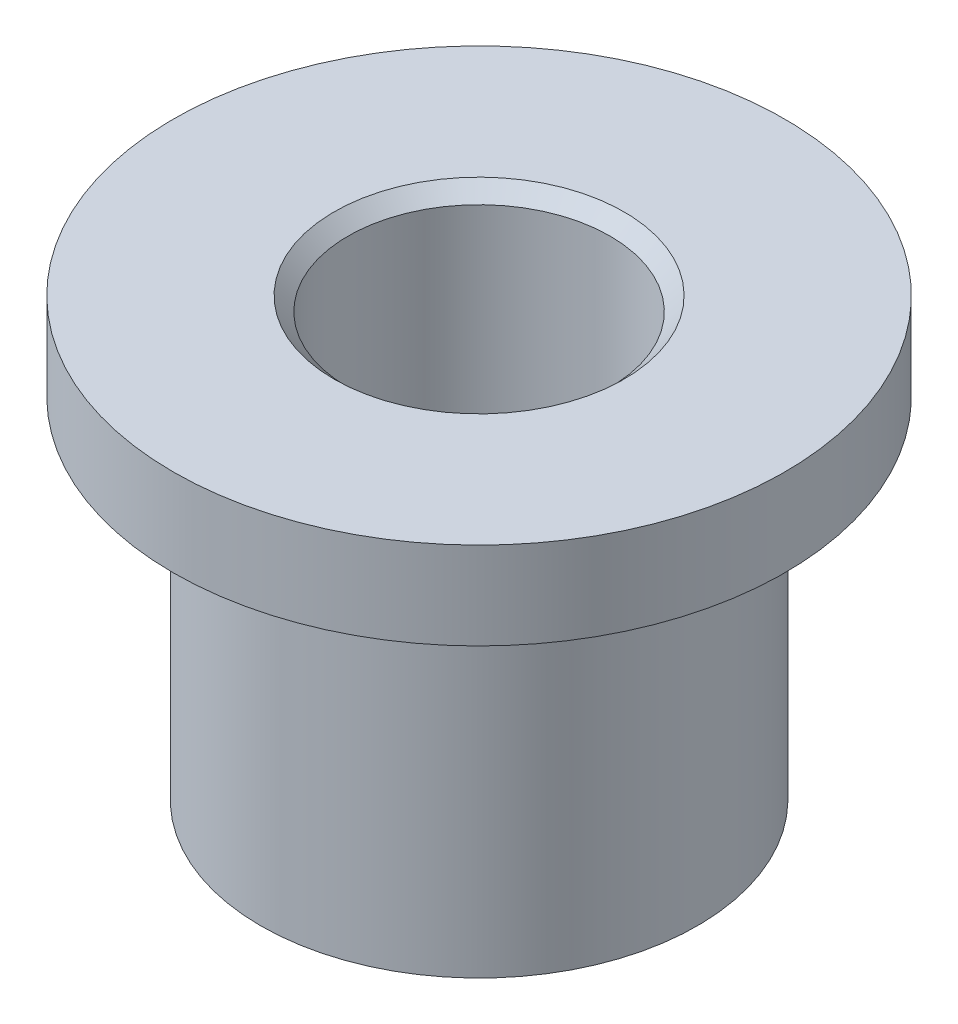
ISO-10303-21;
HEADER;
FILE_DESCRIPTION(('STEP AP214'),'2;1');
FILE_NAME('part.step','',(''),(''),'','','');
FILE_SCHEMA(('AUTOMOTIVE_DESIGN { 1 0 10303 214 1 1 1 1 }'));
ENDSEC;
DATA;
#1=APPLICATION_CONTEXT('core data for automotive mechanical design processes');
#2=APPLICATION_PROTOCOL_DEFINITION('international standard','automotive_design',2000,#1);
#3=PRODUCT_CONTEXT('',#1,'mechanical');
#4=PRODUCT('Part','Part','',(#3));
#5=PRODUCT_RELATED_PRODUCT_CATEGORY('part','',(#4));
#6=PRODUCT_DEFINITION_FORMATION('','',#4);
#7=PRODUCT_DEFINITION_CONTEXT('part definition',#1,'design');
#8=PRODUCT_DEFINITION('design','',#6,#7);
#9=PRODUCT_DEFINITION_SHAPE('','',#8);
#10=(LENGTH_UNIT() NAMED_UNIT(*) SI_UNIT(.MILLI.,.METRE.));
#11=(NAMED_UNIT(*) PLANE_ANGLE_UNIT() SI_UNIT($,.RADIAN.));
#12=(NAMED_UNIT(*) SI_UNIT($,.STERADIAN.) SOLID_ANGLE_UNIT());
#13=UNCERTAINTY_MEASURE_WITH_UNIT(LENGTH_MEASURE(1.E-05),#10,'distance_accuracy_value','');
#14=(GEOMETRIC_REPRESENTATION_CONTEXT(3) GLOBAL_UNCERTAINTY_ASSIGNED_CONTEXT((#13)) GLOBAL_UNIT_ASSIGNED_CONTEXT((#10,
#11,#12)) REPRESENTATION_CONTEXT('',''));
#15=CARTESIAN_POINT('',(0.,0.,0.));
#16=DIRECTION('',(0.,0.,1.));
#17=DIRECTION('',(1.,0.,0.));
#18=AXIS2_PLACEMENT_3D('',#15,#16,#17);
#19=CARTESIAN_POINT('',(0.,6.35,0.));
#20=DIRECTION('',(0.,1.,0.));
#21=DIRECTION('',(0.,0.,1.));
#22=AXIS2_PLACEMENT_3D('',#19,#20,#21);
#23=CYLINDRICAL_SURFACE('',#22,2.38125);
#24=CARTESIAN_POINT('',(0.,3.71475,0.));
#25=DIRECTION('',(0.,1.,0.));
#26=DIRECTION('',(0.,0.,1.));
#27=AXIS2_PLACEMENT_3D('',#24,#25,#26);
#28=CIRCLE('',#27,2.38125);
#29=CARTESIAN_POINT('',(0.,3.71475,2.38125));
#30=VERTEX_POINT('',#29);
#31=EDGE_CURVE('E42',#30,#30,#28,.T.);
#32=ORIENTED_EDGE('',*,*,#31,.T.);
#33=EDGE_LOOP('',(#32));
#34=FACE_BOUND('',#33,.T.);
#35=CARTESIAN_POINT('',(0.,-3.71475,0.));
#36=DIRECTION('',(0.,-1.,0.));
#37=DIRECTION('',(0.,0.,-1.));
#38=AXIS2_PLACEMENT_3D('',#35,#36,#37);
#39=CIRCLE('',#38,2.38125);
#40=CARTESIAN_POINT('',(0.,-3.71475,-2.38125));
#41=VERTEX_POINT('',#40);
#42=EDGE_CURVE('E46',#41,#41,#39,.T.);
#43=ORIENTED_EDGE('',*,*,#42,.T.);
#44=EDGE_LOOP('',(#43));
#45=FACE_BOUND('',#44,.T.);
#46=ADVANCED_FACE('F31',(#34,#45),#23,.F.);
#47=CARTESIAN_POINT('',(-2.38125,3.96875,0.));
#48=DIRECTION('',(0.,1.,0.));
#49=DIRECTION('',(0.,0.,1.));
#50=AXIS2_PLACEMENT_3D('',#47,#48,#49);
#51=PLANE('',#50);
#52=CARTESIAN_POINT('',(0.,3.96875,0.));
#53=DIRECTION('',(0.,1.,0.));
#54=DIRECTION('',(0.,0.,1.));
#55=AXIS2_PLACEMENT_3D('',#52,#53,#54);
#56=CIRCLE('',#55,2.63525);
#57=CARTESIAN_POINT('',(0.,3.96875,2.63525));
#58=VERTEX_POINT('',#57);
#59=EDGE_CURVE('E38',#58,#58,#56,.F.);
#60=ORIENTED_EDGE('',*,*,#59,.T.);
#61=EDGE_LOOP('',(#60));
#62=FACE_BOUND('',#61,.T.);
#63=CARTESIAN_POINT('',(0.,3.96875,0.));
#64=DIRECTION('',(0.,1.,0.));
#65=DIRECTION('',(0.,0.,1.));
#66=AXIS2_PLACEMENT_3D('',#63,#64,#65);
#67=CIRCLE('',#66,5.55625);
#68=CARTESIAN_POINT('',(0.,3.96875,5.55625));
#69=VERTEX_POINT('',#68);
#70=EDGE_CURVE('E51',#69,#69,#67,.T.);
#71=ORIENTED_EDGE('',*,*,#70,.T.);
#72=EDGE_LOOP('',(#71));
#73=FACE_BOUND('',#72,.T.);
#74=ADVANCED_FACE('F79',(#62,#73),#51,.T.);
#75=CARTESIAN_POINT('',(0.,6.35,0.));
#76=DIRECTION('',(0.,1.,0.));
#77=DIRECTION('',(0.,0.,1.));
#78=AXIS2_PLACEMENT_3D('',#75,#76,#77);
#79=CYLINDRICAL_SURFACE('',#78,5.55625);
#80=CARTESIAN_POINT('',(0.,2.38125,0.));
#81=DIRECTION('',(0.,1.,0.));
#82=DIRECTION('',(0.,0.,1.));
#83=AXIS2_PLACEMENT_3D('',#80,#81,#82);
#84=CIRCLE('',#83,5.55625);
#85=CARTESIAN_POINT('',(0.,2.38125,5.55625));
#86=VERTEX_POINT('',#85);
#87=EDGE_CURVE('E54',#86,#86,#84,.T.);
#88=ORIENTED_EDGE('',*,*,#87,.T.);
#89=EDGE_LOOP('',(#88));
#90=FACE_BOUND('',#89,.T.);
#91=ORIENTED_EDGE('',*,*,#70,.F.);
#92=EDGE_LOOP('',(#91));
#93=FACE_BOUND('',#92,.T.);
#94=ADVANCED_FACE('F85',(#90,#93),#79,.T.);
#95=CARTESIAN_POINT('',(-5.55625,2.38125,0.));
#96=DIRECTION('',(0.,-1.,0.));
#97=DIRECTION('',(0.,0.,-1.));
#98=AXIS2_PLACEMENT_3D('',#95,#96,#97);
#99=PLANE('',#98);
#100=CARTESIAN_POINT('',(0.,2.38125,0.));
#101=DIRECTION('',(0.,1.,0.));
#102=DIRECTION('',(0.,0.,1.));
#103=AXIS2_PLACEMENT_3D('',#100,#101,#102);
#104=CIRCLE('',#103,3.96875);
#105=CARTESIAN_POINT('',(0.,2.38125,3.96875));
#106=VERTEX_POINT('',#105);
#107=EDGE_CURVE('E57',#106,#106,#104,.T.);
#108=ORIENTED_EDGE('',*,*,#107,.T.);
#109=EDGE_LOOP('',(#108));
#110=FACE_BOUND('',#109,.T.);
#111=ORIENTED_EDGE('',*,*,#87,.F.);
#112=EDGE_LOOP('',(#111));
#113=FACE_BOUND('',#112,.T.);
#114=ADVANCED_FACE('F76',(#110,#113),#99,.T.);
#115=CARTESIAN_POINT('',(0.,6.35,0.));
#116=DIRECTION('',(0.,1.,0.));
#117=DIRECTION('',(0.,0.,1.));
#118=AXIS2_PLACEMENT_3D('',#115,#116,#117);
#119=CYLINDRICAL_SURFACE('',#118,3.96875);
#120=CARTESIAN_POINT('',(0.,-3.96875,0.));
#121=DIRECTION('',(0.,1.,0.));
#122=DIRECTION('',(0.,0.,1.));
#123=AXIS2_PLACEMENT_3D('',#120,#121,#122);
#124=CIRCLE('',#123,3.96875);
#125=CARTESIAN_POINT('',(0.,-3.96875,3.96875));
#126=VERTEX_POINT('',#125);
#127=EDGE_CURVE('E60',#126,#126,#124,.T.);
#128=ORIENTED_EDGE('',*,*,#127,.T.);
#129=EDGE_LOOP('',(#128));
#130=FACE_BOUND('',#129,.T.);
#131=ORIENTED_EDGE('',*,*,#107,.F.);
#132=EDGE_LOOP('',(#131));
#133=FACE_BOUND('',#132,.T.);
#134=ADVANCED_FACE('F64',(#130,#133),#119,.T.);
#135=CARTESIAN_POINT('',(-3.96875,-3.96875,0.));
#136=DIRECTION('',(0.,-1.,0.));
#137=DIRECTION('',(0.,0.,-1.));
#138=AXIS2_PLACEMENT_3D('',#135,#136,#137);
#139=PLANE('',#138);
#140=CARTESIAN_POINT('',(0.,-3.96875,0.));
#141=DIRECTION('',(0.,-1.,0.));
#142=DIRECTION('',(0.,0.,-1.));
#143=AXIS2_PLACEMENT_3D('',#140,#141,#142);
#144=CIRCLE('',#143,2.63525);
#145=CARTESIAN_POINT('',(0.,-3.96875,-2.63525));
#146=VERTEX_POINT('',#145);
#147=EDGE_CURVE('E10',#146,#146,#144,.F.);
#148=ORIENTED_EDGE('',*,*,#147,.T.);
#149=EDGE_LOOP('',(#148));
#150=FACE_BOUND('',#149,.T.);
#151=ORIENTED_EDGE('',*,*,#127,.F.);
#152=EDGE_LOOP('',(#151));
#153=FACE_BOUND('',#152,.T.);
#154=ADVANCED_FACE('F67',(#150,#153),#139,.T.);
#155=CARTESIAN_POINT('',(0.,3.71475,0.));
#156=DIRECTION('',(0.,1.,0.));
#157=DIRECTION('',(0.,0.,1.));
#158=AXIS2_PLACEMENT_3D('',#155,#156,#157);
#159=CONICAL_SURFACE('',#158,2.38125,0.785398163397452);
#160=ORIENTED_EDGE('',*,*,#59,.F.);
#161=EDGE_LOOP('',(#160));
#162=FACE_BOUND('',#161,.T.);
#163=ORIENTED_EDGE('',*,*,#31,.F.);
#164=EDGE_LOOP('',(#163));
#165=FACE_BOUND('',#164,.T.);
#166=ADVANCED_FACE('F69',(#162,#165),#159,.F.);
#167=CARTESIAN_POINT('',(0.,-3.96875,0.));
#168=DIRECTION('',(0.,-1.,0.));
#169=DIRECTION('',(0.,0.,-1.));
#170=AXIS2_PLACEMENT_3D('',#167,#168,#169);
#171=CONICAL_SURFACE('',#170,2.63525,0.785398163397447);
#172=ORIENTED_EDGE('',*,*,#42,.F.);
#173=EDGE_LOOP('',(#172));
#174=FACE_BOUND('',#173,.T.);
#175=ORIENTED_EDGE('',*,*,#147,.F.);
#176=EDGE_LOOP('',(#175));
#177=FACE_BOUND('',#176,.T.);
#178=ADVANCED_FACE('F33',(#174,#177),#171,.F.);
#179=CLOSED_SHELL('',(#46,#74,#94,#114,#134,#154,#166,#178));
#180=MANIFOLD_SOLID_BREP('B2',#179);
#181=ADVANCED_BREP_SHAPE_REPRESENTATION('',(#18,#180),#14);
#182=SHAPE_DEFINITION_REPRESENTATION(#9,#181);
ENDSEC;
END-ISO-10303-21;
